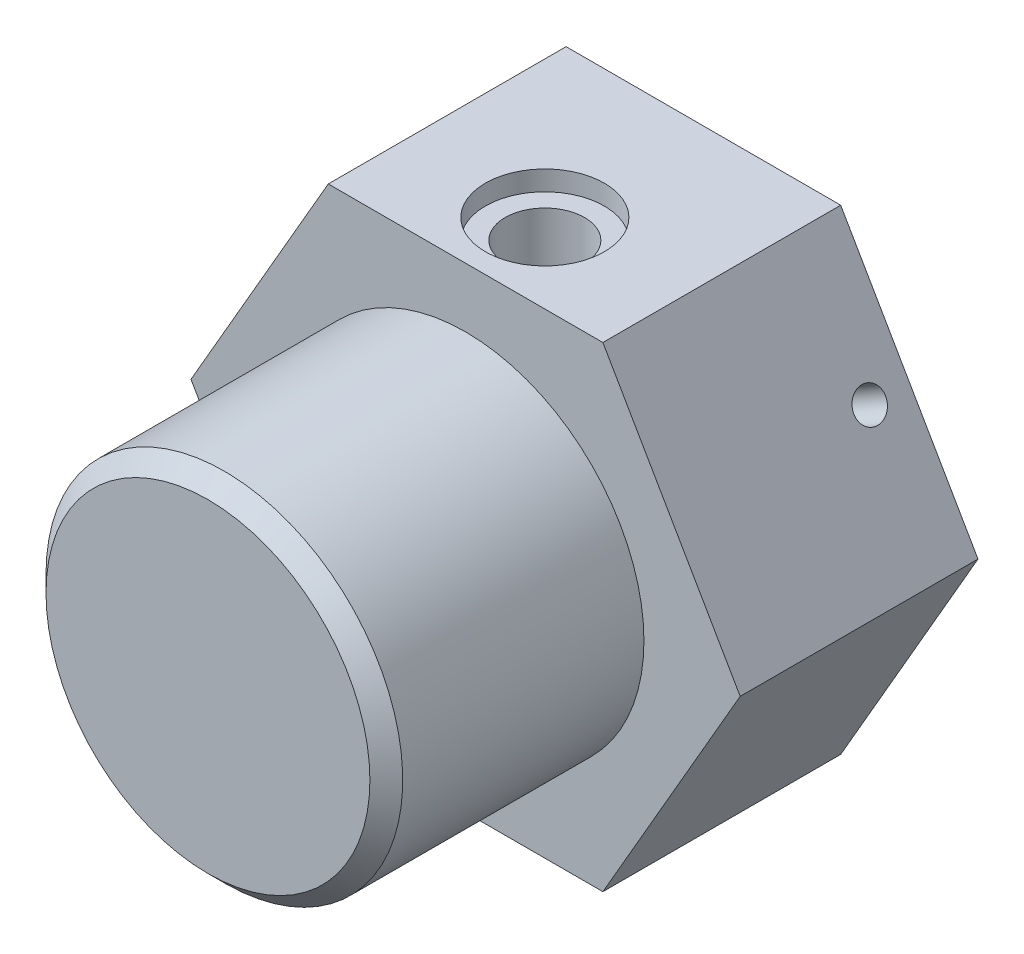
ISO-10303-21;
HEADER;
FILE_DESCRIPTION(('STEP AP214'),'2;1');
FILE_NAME('part.step','',(''),(''),'','','');
FILE_SCHEMA(('AUTOMOTIVE_DESIGN { 1 0 10303 214 1 1 1 1 }'));
ENDSEC;
DATA;
#1=APPLICATION_CONTEXT('core data for automotive mechanical design processes');
#2=APPLICATION_PROTOCOL_DEFINITION('international standard','automotive_design',2000,#1);
#3=PRODUCT_CONTEXT('',#1,'mechanical');
#4=PRODUCT('Part','Part','',(#3));
#5=PRODUCT_RELATED_PRODUCT_CATEGORY('part','',(#4));
#6=PRODUCT_DEFINITION_FORMATION('','',#4);
#7=PRODUCT_DEFINITION_CONTEXT('part definition',#1,'design');
#8=PRODUCT_DEFINITION('design','',#6,#7);
#9=PRODUCT_DEFINITION_SHAPE('','',#8);
#10=(LENGTH_UNIT() NAMED_UNIT(*) SI_UNIT(.MILLI.,.METRE.));
#11=(NAMED_UNIT(*) PLANE_ANGLE_UNIT() SI_UNIT($,.RADIAN.));
#12=(NAMED_UNIT(*) SI_UNIT($,.STERADIAN.) SOLID_ANGLE_UNIT());
#13=UNCERTAINTY_MEASURE_WITH_UNIT(LENGTH_MEASURE(1.E-05),#10,'distance_accuracy_value','');
#14=(GEOMETRIC_REPRESENTATION_CONTEXT(3) GLOBAL_UNCERTAINTY_ASSIGNED_CONTEXT((#13)) GLOBAL_UNIT_ASSIGNED_CONTEXT((#10,
#11,#12)) REPRESENTATION_CONTEXT('',''));
#15=CARTESIAN_POINT('',(0.,0.,0.));
#16=DIRECTION('',(0.,0.,1.));
#17=DIRECTION('',(1.,0.,0.));
#18=AXIS2_PLACEMENT_3D('',#15,#16,#17);
#19=CARTESIAN_POINT('',(0.,12.,8.));
#20=DIRECTION('',(0.,1.,0.));
#21=DIRECTION('',(0.,0.,1.));
#22=AXIS2_PLACEMENT_3D('',#19,#20,#21);
#23=CYLINDRICAL_SURFACE('',#22,1.99999999999999);
#24=CARTESIAN_POINT('',(0.,5.99999999999999,9.99999999999999));
#25=CARTESIAN_POINT('',(0.109126725773447,6.00000030601887,10.0000005074633));
#26=CARTESIAN_POINT('',(0.2182503890771,5.99699539015089,9.99103946774556));
#27=CARTESIAN_POINT('',(0.433283521745944,5.98530420406561,9.95554178236555));
#28=CARTESIAN_POINT('',(0.539192656237634,5.97661734404304,9.92900331210215));
#29=CARTESIAN_POINT('',(0.74466557900355,5.95450615812885,9.85936151323189));
#30=CARTESIAN_POINT('',(0.844239651772065,5.94108975461706,9.81628587508145));
#31=CARTESIAN_POINT('',(1.03474987361065,5.91088891434683,9.7149176543233));
#32=CARTESIAN_POINT('',(1.12568431391741,5.89410381335555,9.65662206999479));
#33=CARTESIAN_POINT('',(1.29948335004453,5.85828188886009,9.52434839028249));
#34=CARTESIAN_POINT('',(1.38200740059661,5.83919112927569,9.44993753147901));
#35=CARTESIAN_POINT('',(1.53366538540416,5.80120629566242,9.28846569058686));
#36=CARTESIAN_POINT('',(1.60279637097892,5.78231226581098,9.20140193014297));
#37=CARTESIAN_POINT('',(1.72764988445571,5.74626664954547,9.01402976960708));
#38=CARTESIAN_POINT('',(1.78292971644206,5.72918078551376,8.91341252053575));
#39=CARTESIAN_POINT('',(1.87563774775544,5.69950610837202,8.7036478110829));
#40=CARTESIAN_POINT('',(1.91307139477352,5.68691592321491,8.59450296567451));
#41=CARTESIAN_POINT('',(1.96774692301832,5.66822606538754,8.37465355700658));
#42=CARTESIAN_POINT('',(1.98562689654353,5.66192191539222,8.26412558302187));
#43=CARTESIAN_POINT('',(2.00268224666895,5.65591313259014,8.04147249168824));
#44=CARTESIAN_POINT('',(2.00186340320943,5.65620646045459,7.92934787858162));
#45=CARTESIAN_POINT('',(1.98203980740683,5.6631803001636,7.71212673911196));
#46=CARTESIAN_POINT('',(1.96386782633398,5.66956831735065,7.60694319416196));
#47=CARTESIAN_POINT('',(1.91121232569883,5.68753315449101,7.40121316078633));
#48=CARTESIAN_POINT('',(1.87672685318374,5.69911059568215,7.30066722912986));
#49=CARTESIAN_POINT('',(1.79187811612042,5.72635822262497,7.10517450081705));
#50=CARTESIAN_POINT('',(1.74126809741452,5.74209131586234,7.01034394906095));
#51=CARTESIAN_POINT('',(1.62577821260627,5.77585117151452,6.83025818344055));
#52=CARTESIAN_POINT('',(1.560894224728,5.79387859580926,6.74500574613324));
#53=CARTESIAN_POINT('',(1.41469866536447,5.83134658335481,6.58181680367846));
#54=CARTESIAN_POINT('',(1.33270630015262,5.85081178709685,6.50449461098187));
#55=CARTESIAN_POINT('',(1.15667913994012,5.88813876774073,6.36453746667321));
#56=CARTESIAN_POINT('',(1.06264319132163,5.90600039076134,6.30190392367102));
#57=CARTESIAN_POINT('',(0.863895226092532,5.93834215875586,6.19260739952987));
#58=CARTESIAN_POINT('',(0.759086552832671,5.95278700016078,6.14610901731854));
#59=CARTESIAN_POINT('',(0.542538166729014,5.97641134288869,6.07159365208859));
#60=CARTESIAN_POINT('',(0.430800876309906,5.98559267309758,6.04357024915313));
#61=CARTESIAN_POINT('',(0.208767659058608,5.9973525414288,6.00788866795529));
#62=CARTESIAN_POINT('',(0.0986191997296925,6.00020003667455,5.99940038165451));
#63=CARTESIAN_POINT('',(-0.121550139920474,5.99977805389654,6.00066534719695));
#64=CARTESIAN_POINT('',(-0.2315710386393,5.99650960838724,6.01041551995976));
#65=CARTESIAN_POINT('',(-0.445039732608509,5.98440049434208,6.04722381547193));
#66=CARTESIAN_POINT('',(-0.548585613669684,5.97572397422384,6.073772412099));
#67=CARTESIAN_POINT('',(-0.749711917159143,5.95383693660139,6.14278688893346));
#68=CARTESIAN_POINT('',(-0.847291577017209,5.94062584093349,6.18525479893558));
#69=CARTESIAN_POINT('',(-1.03657659278654,5.91057862574579,6.28614086368158));
#70=CARTESIAN_POINT('',(-1.12805991843429,5.89365629511571,6.34494918656635));
#71=CARTESIAN_POINT('',(-1.30012966027117,5.85810507832524,6.47638830002697));
#72=CARTESIAN_POINT('',(-1.38071273559115,5.83947567187654,6.54902331206354));
#73=CARTESIAN_POINT('',(-1.53250501561259,5.80153695960889,6.70995750201318));
#74=CARTESIAN_POINT('',(-1.60312193849153,5.78223522174855,6.79881845385373));
#75=CARTESIAN_POINT('',(-1.72851504464714,5.74599946589417,6.98754313562178));
#76=CARTESIAN_POINT('',(-1.78329109586202,5.72906546764004,7.08740695726816));
#77=CARTESIAN_POINT('',(-1.87519386083271,5.69964783582766,7.2953460305798));
#78=CARTESIAN_POINT('',(-1.91235626433003,5.68715521585957,7.40340415833754));
#79=CARTESIAN_POINT('',(-1.9677893335187,5.66821664612899,7.62475730008827));
#80=CARTESIAN_POINT('',(-1.98606850990787,5.66176797247278,7.7380499308087));
#81=CARTESIAN_POINT('',(-2.00255256495468,5.65595717748354,7.96039419208183));
#82=CARTESIAN_POINT('',(-2.00174051461679,5.6562480051483,8.06936468057365));
#83=CARTESIAN_POINT('',(-1.98248458689738,5.66302539647734,8.28553014984412));
#84=CARTESIAN_POINT('',(-1.96404175891716,5.66951159138723,8.39272523591018));
#85=CARTESIAN_POINT('',(-1.91074362625868,5.68769048609783,8.60027132600494));
#86=CARTESIAN_POINT('',(-1.87620669203102,5.69928196044954,8.70071365000899));
#87=CARTESIAN_POINT('',(-1.79195873151948,5.72632797636937,8.89445481387654));
#88=CARTESIAN_POINT('',(-1.7422443371076,5.74178337526786,8.98775206237601));
#89=CARTESIAN_POINT('',(-1.62652138516685,5.77565658452092,9.16896733984582));
#90=CARTESIAN_POINT('',(-1.55989648552915,5.79417423284273,9.25647300379677));
#91=CARTESIAN_POINT('',(-1.41328576627129,5.83166712566505,9.4193796267684));
#92=CARTESIAN_POINT('',(-1.33329616890296,5.85064249824744,9.49477715137614));
#93=CARTESIAN_POINT('',(-1.15848311384137,5.88780061051088,9.63428882457835));
#94=CARTESIAN_POINT('',(-1.06320302699945,5.90592363602513,9.69784869550199));
#95=CARTESIAN_POINT('',(-0.862714714813243,5.93851982345223,9.80798085770129));
#96=CARTESIAN_POINT('',(-0.757509036264691,5.95299391815859,9.85455749184408));
#97=CARTESIAN_POINT('',(-0.544987294401947,5.97611030137083,9.92744326497734));
#98=CARTESIAN_POINT('',(-0.437975515352813,5.98498424845044,9.95456493252674));
#99=CARTESIAN_POINT('',(-0.220640832020491,5.99692814128443,9.99084056135424));
#100=CARTESIAN_POINT('',(-0.110318851137491,5.99999969063809,9.99999948699307));
#101=CARTESIAN_POINT('',(0.,5.99999999999999,9.99999999999999));
#102=B_SPLINE_CURVE_WITH_KNOTS('',3,(#24,#25,#26,#27,#28,#29,#30,#31,#32,#33,#34,#35,#36,#37,
#38,#39,#40,#41,#42,#43,#44,#45,#46,#47,#48,#49,#50,#51,#52,#53,#54,#55,#56,#57,#58,#59,#60,#61,
#62,#63,#64,#65,#66,#67,#68,#69,#70,#71,#72,#73,#74,#75,#76,#77,#78,#79,#80,#81,#82,#83,#84,#85,
#86,#87,#88,#89,#90,#91,#92,#93,#94,#95,#96,#97,#98,#99,#100,#101),.UNSPECIFIED.,.T.,.F.,(4,2,2,
2,2,2,2,2,2,2,2,2,2,2,2,2,2,2,2,2,2,2,2,2,2,2,2,2,2,2,2,2,2,2,2,2,2,2,4),(0.,0.32697421205202,
0.653982370535039,0.980445345740543,1.30697275559819,1.64369368565511,1.9804886657506,
2.3269676964694,2.67334089385665,3.00803851483679,3.34263267974969,3.66193653102559,
3.98127861710962,4.3057634231026,4.63034205116413,4.97186611622732,5.31342291933235,
5.65836811300713,6.00319337754414,6.33307166350337,6.6628942632835,6.98316315956424,
7.30347290568205,7.6322079968747,7.96104361643779,8.304820457615,8.6486001646999,
8.99168027653537,9.33460569411677,9.65991332128513,9.98520158702746,10.3043117416083,
10.6234927635195,10.9566013338361,11.2898042224755,11.635993216702,11.9820936230491,
12.3127311674762,12.6432773207627),.UNSPECIFIED.);
#103=CARTESIAN_POINT('',(0.,5.99999999999999,9.99999999999999));
#104=VERTEX_POINT('',#103);
#105=EDGE_CURVE('E181',#104,#104,#102,.T.);
#106=ORIENTED_EDGE('',*,*,#105,.F.);
#107=EDGE_LOOP('',(#106));
#108=FACE_BOUND('',#107,.T.);
#109=CARTESIAN_POINT('',(0.,11.,8.));
#110=DIRECTION('',(0.,1.,0.));
#111=DIRECTION('',(-1.,0.,0.));
#112=AXIS2_PLACEMENT_3D('',#109,#110,#111);
#113=CIRCLE('',#112,1.99999999999999);
#114=CARTESIAN_POINT('',(-1.99999999999999,11.,8.));
#115=VERTEX_POINT('',#114);
#116=EDGE_CURVE('E62',#115,#115,#113,.F.);
#117=ORIENTED_EDGE('',*,*,#116,.F.);
#118=EDGE_LOOP('',(#117));
#119=FACE_BOUND('',#118,.T.);
#120=ADVANCED_FACE('F58',(#108,#119),#23,.F.);
#121=CARTESIAN_POINT('',(0.,-5.99999999999999,9.99999999999999));
#122=CARTESIAN_POINT('',(-0.109126725773445,-6.00000030601887,10.0000005074633));
#123=CARTESIAN_POINT('',(-0.218250389077098,-5.99699539015089,9.99103946774556));
#124=CARTESIAN_POINT('',(-0.433283521745942,-5.98530420406561,9.95554178236555));
#125=CARTESIAN_POINT('',(-0.539192656237632,-5.97661734404304,9.92900331210215));
#126=CARTESIAN_POINT('',(-0.744665579003548,-5.95450615812885,9.85936151323189));
#127=CARTESIAN_POINT('',(-0.844239651772063,-5.94108975461706,9.81628587508145));
#128=CARTESIAN_POINT('',(-1.03474987361064,-5.91088891434683,9.7149176543233));
#129=CARTESIAN_POINT('',(-1.12568431391741,-5.89410381335555,9.65662206999479));
#130=CARTESIAN_POINT('',(-1.29948335004453,-5.85828188886009,9.52434839028249));
#131=CARTESIAN_POINT('',(-1.38200740059661,-5.83919112927569,9.44993753147901));
#132=CARTESIAN_POINT('',(-1.53366538540416,-5.80120629566242,9.28846569058686));
#133=CARTESIAN_POINT('',(-1.60279637097892,-5.78231226581098,9.20140193014297));
#134=CARTESIAN_POINT('',(-1.72764988445571,-5.74626664954547,9.01402976960708));
#135=CARTESIAN_POINT('',(-1.78292971644206,-5.72918078551376,8.91341252053575));
#136=CARTESIAN_POINT('',(-1.87563774775543,-5.69950610837202,8.7036478110829));
#137=CARTESIAN_POINT('',(-1.91307139477352,-5.68691592321491,8.59450296567451));
#138=CARTESIAN_POINT('',(-1.96774692301832,-5.66822606538754,8.37465355700658));
#139=CARTESIAN_POINT('',(-1.98562689654353,-5.66192191539222,8.26412558302187));
#140=CARTESIAN_POINT('',(-2.00268224666894,-5.65591313259015,8.04147249168824));
#141=CARTESIAN_POINT('',(-2.00186340320943,-5.65620646045459,7.92934787858162));
#142=CARTESIAN_POINT('',(-1.98203980740683,-5.6631803001636,7.71212673911196));
#143=CARTESIAN_POINT('',(-1.96386782633398,-5.66956831735065,7.60694319416196));
#144=CARTESIAN_POINT('',(-1.91121232569882,-5.68753315449101,7.40121316078633));
#145=CARTESIAN_POINT('',(-1.87672685318373,-5.69911059568215,7.30066722912986));
#146=CARTESIAN_POINT('',(-1.79187811612041,-5.72635822262497,7.10517450081705));
#147=CARTESIAN_POINT('',(-1.74126809741452,-5.74209131586234,7.01034394906095));
#148=CARTESIAN_POINT('',(-1.62577821260627,-5.77585117151452,6.83025818344055));
#149=CARTESIAN_POINT('',(-1.560894224728,-5.79387859580927,6.74500574613324));
#150=CARTESIAN_POINT('',(-1.41469866536447,-5.83134658335481,6.58181680367846));
#151=CARTESIAN_POINT('',(-1.33270630015262,-5.85081178709685,6.50449461098187));
#152=CARTESIAN_POINT('',(-1.15667913994012,-5.88813876774073,6.36453746667321));
#153=CARTESIAN_POINT('',(-1.06264319132162,-5.90600039076134,6.30190392367101));
#154=CARTESIAN_POINT('',(-0.86389522609253,-5.93834215875586,6.19260739952987));
#155=CARTESIAN_POINT('',(-0.759086552832668,-5.95278700016078,6.14610901731854));
#156=CARTESIAN_POINT('',(-0.542538166729011,-5.97641134288869,6.07159365208859));
#157=CARTESIAN_POINT('',(-0.430800876309903,-5.98559267309758,6.04357024915313));
#158=CARTESIAN_POINT('',(-0.208767659058605,-5.9973525414288,6.00788866795529));
#159=CARTESIAN_POINT('',(-0.0986191997296898,-6.00020003667455,5.99940038165451));
#160=CARTESIAN_POINT('',(0.121550139920476,-5.99977805389654,6.00066534719695));
#161=CARTESIAN_POINT('',(0.231571038639302,-5.99650960838724,6.01041551995976));
#162=CARTESIAN_POINT('',(0.445039732608511,-5.98440049434208,6.04722381547193));
#163=CARTESIAN_POINT('',(0.548585613669687,-5.97572397422384,6.073772412099));
#164=CARTESIAN_POINT('',(0.749711917159146,-5.95383693660139,6.14278688893347));
#165=CARTESIAN_POINT('',(0.847291577017212,-5.94062584093349,6.18525479893558));
#166=CARTESIAN_POINT('',(1.03657659278654,-5.91057862574579,6.28614086368158));
#167=CARTESIAN_POINT('',(1.12805991843429,-5.89365629511571,6.34494918656635));
#168=CARTESIAN_POINT('',(1.30012966027117,-5.85810507832524,6.47638830002697));
#169=CARTESIAN_POINT('',(1.38071273559115,-5.83947567187654,6.54902331206354));
#170=CARTESIAN_POINT('',(1.53250501561259,-5.80153695960889,6.70995750201318));
#171=CARTESIAN_POINT('',(1.60312193849154,-5.78223522174855,6.79881845385373));
#172=CARTESIAN_POINT('',(1.72851504464714,-5.74599946589417,6.98754313562178));
#173=CARTESIAN_POINT('',(1.78329109586202,-5.72906546764004,7.08740695726816));
#174=CARTESIAN_POINT('',(1.87519386083272,-5.69964783582766,7.2953460305798));
#175=CARTESIAN_POINT('',(1.91235626433004,-5.68715521585957,7.40340415833754));
#176=CARTESIAN_POINT('',(1.96778933351871,-5.66821664612898,7.62475730008827));
#177=CARTESIAN_POINT('',(1.98606850990787,-5.66176797247278,7.7380499308087));
#178=CARTESIAN_POINT('',(2.00255256495468,-5.65595717748354,7.96039419208183));
#179=CARTESIAN_POINT('',(2.00174051461679,-5.6562480051483,8.06936468057365));
#180=CARTESIAN_POINT('',(1.98248458689738,-5.66302539647734,8.28553014984412));
#181=CARTESIAN_POINT('',(1.96404175891716,-5.66951159138723,8.39272523591018));
#182=CARTESIAN_POINT('',(1.91074362625868,-5.68769048609783,8.60027132600495));
#183=CARTESIAN_POINT('',(1.87620669203102,-5.69928196044954,8.70071365000899));
#184=CARTESIAN_POINT('',(1.79195873151949,-5.72632797636936,8.89445481387654));
#185=CARTESIAN_POINT('',(1.7422443371076,-5.74178337526786,8.98775206237601));
#186=CARTESIAN_POINT('',(1.62652138516685,-5.77565658452092,9.16896733984582));
#187=CARTESIAN_POINT('',(1.55989648552916,-5.79417423284273,9.25647300379677));
#188=CARTESIAN_POINT('',(1.41328576627129,-5.83166712566505,9.41937962676839));
#189=CARTESIAN_POINT('',(1.33329616890296,-5.85064249824744,9.49477715137614));
#190=CARTESIAN_POINT('',(1.15848311384137,-5.88780061051088,9.63428882457835));
#191=CARTESIAN_POINT('',(1.06320302699945,-5.90592363602513,9.69784869550199));
#192=CARTESIAN_POINT('',(0.862714714813245,-5.93851982345223,9.80798085770129));
#193=CARTESIAN_POINT('',(0.757509036264693,-5.95299391815859,9.85455749184408));
#194=CARTESIAN_POINT('',(0.544987294401949,-5.97611030137083,9.92744326497734));
#195=CARTESIAN_POINT('',(0.437975515352816,-5.98498424845044,9.95456493252674));
#196=CARTESIAN_POINT('',(0.220640832020494,-5.99692814128443,9.99084056135424));
#197=CARTESIAN_POINT('',(0.110318851137493,-5.99999969063809,9.99999948699307));
#198=CARTESIAN_POINT('',(0.,-5.99999999999999,9.99999999999999));
#199=B_SPLINE_CURVE_WITH_KNOTS('',3,(#121,#122,#123,#124,#125,#126,#127,#128,#129,#130,#131,
#132,#133,#134,#135,#136,#137,#138,#139,#140,#141,#142,#143,#144,#145,#146,#147,#148,#149,#150,
#151,#152,#153,#154,#155,#156,#157,#158,#159,#160,#161,#162,#163,#164,#165,#166,#167,#168,#169,
#170,#171,#172,#173,#174,#175,#176,#177,#178,#179,#180,#181,#182,#183,#184,#185,#186,#187,#188,
#189,#190,#191,#192,#193,#194,#195,#196,#197,#198),.UNSPECIFIED.,.T.,.F.,(4,2,2,2,2,2,2,2,2,2,2,
2,2,2,2,2,2,2,2,2,2,2,2,2,2,2,2,2,2,2,2,2,2,2,2,2,2,2,4),(0.,0.32697421205202,0.653982370535039,
0.980445345740543,1.3069727555982,1.64369368565511,1.9804886657506,2.3269676964694,
2.67334089385665,3.00803851483679,3.3426326797497,3.66193653102559,3.98127861710962,
4.3057634231026,4.63034205116413,4.97186611622732,5.31342291933235,5.65836811300713,
6.00319337754414,6.33307166350337,6.66289426328351,6.98316315956424,7.30347290568205,
7.6322079968747,7.96104361643779,8.30482045761501,8.6486001646999,8.99168027653537,
9.33460569411677,9.65991332128513,9.98520158702747,10.3043117416083,10.6234927635195,
10.956601333836,11.2898042224755,11.635993216702,11.9820936230491,12.3127311674762,
12.6432773207627),.UNSPECIFIED.);
#200=CARTESIAN_POINT('',(0.,-5.99999999999999,9.99999999999999));
#201=VERTEX_POINT('',#200);
#202=EDGE_CURVE('E190',#201,#201,#199,.T.);
#203=ORIENTED_EDGE('',*,*,#202,.F.);
#204=EDGE_LOOP('',(#203));
#205=FACE_BOUND('',#204,.T.);
#206=CARTESIAN_POINT('',(0.,-11.,8.));
#207=DIRECTION('',(0.,-1.,0.));
#208=DIRECTION('',(1.,0.,0.));
#209=AXIS2_PLACEMENT_3D('',#206,#207,#208);
#210=CIRCLE('',#209,1.99999999999999);
#211=CARTESIAN_POINT('',(1.99999999999999,-11.,8.));
#212=VERTEX_POINT('',#211);
#213=EDGE_CURVE('E251',#212,#212,#210,.F.);
#214=ORIENTED_EDGE('',*,*,#213,.F.);
#215=EDGE_LOOP('',(#214));
#216=FACE_BOUND('',#215,.T.);
#217=ADVANCED_FACE('F198',(#205,#216),#23,.F.);
#218=CARTESIAN_POINT('',(13.856406460551,0.,12.));
#219=DIRECTION('',(-0.866025403784439,-0.5,0.));
#220=DIRECTION('',(0.5,-0.866025403784439,0.));
#221=AXIS2_PLACEMENT_3D('',#218,#219,#220);
#222=PLANE('',#221);
#223=CARTESIAN_POINT('',(10.3923048454133,6.,2.));
#224=DIRECTION('',(0.866025403784439,0.5,0.));
#225=DIRECTION('',(-0.5,0.866025403784439,0.));
#226=AXIS2_PLACEMENT_3D('',#223,#224,#225);
#227=CIRCLE('',#226,0.799999999999988);
#228=CARTESIAN_POINT('',(9.99230484541328,6.69282032302754,2.));
#229=VERTEX_POINT('',#228);
#230=EDGE_CURVE('E217',#229,#229,#227,.T.);
#231=ORIENTED_EDGE('',*,*,#230,.F.);
#232=EDGE_LOOP('',(#231));
#233=FACE_BOUND('',#232,.T.);
#234=DIRECTION('',(-0.5,0.866025403784439,0.));
#235=VECTOR('',#234,1.);
#236=CARTESIAN_POINT('',(13.856406460551,0.,0.));
#237=LINE('',#236,#235);
#238=CARTESIAN_POINT('',(13.856406460551,0.,0.));
#239=VERTEX_POINT('',#238);
#240=CARTESIAN_POINT('',(6.92820323027551,12.,0.));
#241=VERTEX_POINT('',#240);
#242=EDGE_CURVE('E154',#239,#241,#237,.T.);
#243=ORIENTED_EDGE('',*,*,#242,.T.);
#244=DIRECTION('',(0.,0.,-1.));
#245=VECTOR('',#244,1.);
#246=CARTESIAN_POINT('',(6.92820323027551,12.,12.));
#247=LINE('',#246,#245);
#248=CARTESIAN_POINT('',(6.92820323027551,12.,12.));
#249=VERTEX_POINT('',#248);
#250=EDGE_CURVE('E13',#249,#241,#247,.T.);
#251=ORIENTED_EDGE('',*,*,#250,.F.);
#252=DIRECTION('',(-0.5,0.866025403784439,0.));
#253=VECTOR('',#252,1.);
#254=CARTESIAN_POINT('',(13.856406460551,0.,12.));
#255=LINE('',#254,#253);
#256=CARTESIAN_POINT('',(13.856406460551,0.,12.));
#257=VERTEX_POINT('',#256);
#258=EDGE_CURVE('E171',#257,#249,#255,.T.);
#259=ORIENTED_EDGE('',*,*,#258,.F.);
#260=DIRECTION('',(0.,0.,-1.));
#261=VECTOR('',#260,1.);
#262=CARTESIAN_POINT('',(13.856406460551,0.,12.));
#263=LINE('',#262,#261);
#264=EDGE_CURVE('E150',#257,#239,#263,.T.);
#265=ORIENTED_EDGE('',*,*,#264,.T.);
#266=EDGE_LOOP('',(#243,#251,#259,#265));
#267=FACE_BOUND('',#266,.T.);
#268=ADVANCED_FACE('F60',(#233,#267),#222,.F.);
#269=CARTESIAN_POINT('',(6.92820323027551,12.,12.));
#270=DIRECTION('',(0.,-1.,0.));
#271=DIRECTION('',(1.,0.,0.));
#272=AXIS2_PLACEMENT_3D('',#269,#270,#271);
#273=PLANE('',#272);
#274=CARTESIAN_POINT('',(0.,12.,8.));
#275=DIRECTION('',(0.,1.,0.));
#276=DIRECTION('',(-1.,0.,0.));
#277=AXIS2_PLACEMENT_3D('',#274,#275,#276);
#278=CIRCLE('',#277,3.);
#279=CARTESIAN_POINT('',(-3.,12.,8.));
#280=VERTEX_POINT('',#279);
#281=EDGE_CURVE('E271',#280,#280,#278,.T.);
#282=ORIENTED_EDGE('',*,*,#281,.F.);
#283=EDGE_LOOP('',(#282));
#284=FACE_BOUND('',#283,.T.);
#285=DIRECTION('',(-1.,0.,0.));
#286=VECTOR('',#285,1.);
#287=CARTESIAN_POINT('',(6.92820323027551,12.,0.));
#288=LINE('',#287,#286);
#289=CARTESIAN_POINT('',(-6.92820323027551,12.,0.));
#290=VERTEX_POINT('',#289);
#291=EDGE_CURVE('E158',#241,#290,#288,.T.);
#292=ORIENTED_EDGE('',*,*,#291,.T.);
#293=DIRECTION('',(0.,0.,-1.));
#294=VECTOR('',#293,1.);
#295=CARTESIAN_POINT('',(-6.92820323027551,12.,12.));
#296=LINE('',#295,#294);
#297=CARTESIAN_POINT('',(-6.92820323027551,12.,12.));
#298=VERTEX_POINT('',#297);
#299=EDGE_CURVE('E69',#298,#290,#296,.T.);
#300=ORIENTED_EDGE('',*,*,#299,.F.);
#301=DIRECTION('',(-1.,0.,0.));
#302=VECTOR('',#301,1.);
#303=CARTESIAN_POINT('',(6.92820323027551,12.,12.));
#304=LINE('',#303,#302);
#305=EDGE_CURVE('E116',#249,#298,#304,.T.);
#306=ORIENTED_EDGE('',*,*,#305,.F.);
#307=ORIENTED_EDGE('',*,*,#250,.T.);
#308=EDGE_LOOP('',(#292,#300,#306,#307));
#309=FACE_BOUND('',#308,.T.);
#310=ADVANCED_FACE('F355',(#284,#309),#273,.F.);
#311=CARTESIAN_POINT('',(-6.92820323027551,12.,12.));
#312=DIRECTION('',(0.866025403784439,-0.499999999999999,0.));
#313=DIRECTION('',(0.499999999999999,0.866025403784439,0.));
#314=AXIS2_PLACEMENT_3D('',#311,#312,#313);
#315=PLANE('',#314);
#316=DIRECTION('',(-0.499999999999999,-0.866025403784439,0.));
#317=VECTOR('',#316,1.);
#318=CARTESIAN_POINT('',(-6.92820323027551,12.,0.));
#319=LINE('',#318,#317);
#320=CARTESIAN_POINT('',(-13.856406460551,0.,0.));
#321=VERTEX_POINT('',#320);
#322=EDGE_CURVE('E162',#290,#321,#319,.T.);
#323=ORIENTED_EDGE('',*,*,#322,.T.);
#324=DIRECTION('',(0.,0.,-1.));
#325=VECTOR('',#324,1.);
#326=CARTESIAN_POINT('',(-13.856406460551,0.,12.));
#327=LINE('',#326,#325);
#328=CARTESIAN_POINT('',(-13.856406460551,0.,12.));
#329=VERTEX_POINT('',#328);
#330=EDGE_CURVE('E142',#329,#321,#327,.T.);
#331=ORIENTED_EDGE('',*,*,#330,.F.);
#332=DIRECTION('',(-0.499999999999999,-0.866025403784439,0.));
#333=VECTOR('',#332,1.);
#334=CARTESIAN_POINT('',(-6.92820323027551,12.,12.));
#335=LINE('',#334,#333);
#336=EDGE_CURVE('E131',#298,#329,#335,.T.);
#337=ORIENTED_EDGE('',*,*,#336,.F.);
#338=ORIENTED_EDGE('',*,*,#299,.T.);
#339=EDGE_LOOP('',(#323,#331,#337,#338));
#340=FACE_BOUND('',#339,.T.);
#341=ADVANCED_FACE('F351',(#340),#315,.F.);
#342=CARTESIAN_POINT('',(-13.856406460551,0.,12.));
#343=DIRECTION('',(0.866025403784439,0.5,0.));
#344=DIRECTION('',(-0.5,0.866025403784439,0.));
#345=AXIS2_PLACEMENT_3D('',#342,#343,#344);
#346=PLANE('',#345);
#347=DIRECTION('',(0.5,-0.866025403784438,0.));
#348=VECTOR('',#347,1.);
#349=CARTESIAN_POINT('',(-13.856406460551,0.,0.));
#350=LINE('',#349,#348);
#351=CARTESIAN_POINT('',(-6.9282032302755,-12.,0.));
#352=VERTEX_POINT('',#351);
#353=EDGE_CURVE('E140',#321,#352,#350,.T.);
#354=ORIENTED_EDGE('',*,*,#353,.T.);
#355=DIRECTION('',(0.,0.,-1.));
#356=VECTOR('',#355,1.);
#357=CARTESIAN_POINT('',(-6.9282032302755,-12.,12.));
#358=LINE('',#357,#356);
#359=CARTESIAN_POINT('',(-6.9282032302755,-12.,12.));
#360=VERTEX_POINT('',#359);
#361=EDGE_CURVE('E137',#360,#352,#358,.T.);
#362=ORIENTED_EDGE('',*,*,#361,.F.);
#363=DIRECTION('',(0.5,-0.866025403784438,0.));
#364=VECTOR('',#363,1.);
#365=CARTESIAN_POINT('',(-13.856406460551,0.,12.));
#366=LINE('',#365,#364);
#367=EDGE_CURVE('E124',#329,#360,#366,.T.);
#368=ORIENTED_EDGE('',*,*,#367,.F.);
#369=ORIENTED_EDGE('',*,*,#330,.T.);
#370=EDGE_LOOP('',(#354,#362,#368,#369));
#371=FACE_BOUND('',#370,.T.);
#372=ADVANCED_FACE('F138',(#371),#346,.F.);
#373=CARTESIAN_POINT('',(-6.9282032302755,-12.,12.));
#374=DIRECTION('',(0.,1.,0.));
#375=DIRECTION('',(-1.,0.,0.));
#376=AXIS2_PLACEMENT_3D('',#373,#374,#375);
#377=PLANE('',#376);
#378=CARTESIAN_POINT('',(0.,-12.,8.));
#379=DIRECTION('',(0.,-1.,0.));
#380=DIRECTION('',(1.,0.,0.));
#381=AXIS2_PLACEMENT_3D('',#378,#379,#380);
#382=CIRCLE('',#381,3.);
#383=CARTESIAN_POINT('',(3.,-12.,8.));
#384=VERTEX_POINT('',#383);
#385=EDGE_CURVE('E259',#384,#384,#382,.T.);
#386=ORIENTED_EDGE('',*,*,#385,.F.);
#387=EDGE_LOOP('',(#386));
#388=FACE_BOUND('',#387,.T.);
#389=DIRECTION('',(1.,0.,0.));
#390=VECTOR('',#389,1.);
#391=CARTESIAN_POINT('',(-6.9282032302755,-12.,0.));
#392=LINE('',#391,#390);
#393=CARTESIAN_POINT('',(6.92820323027551,-12.,0.));
#394=VERTEX_POINT('',#393);
#395=EDGE_CURVE('E102',#352,#394,#392,.T.);
#396=ORIENTED_EDGE('',*,*,#395,.T.);
#397=DIRECTION('',(0.,0.,-1.));
#398=VECTOR('',#397,1.);
#399=CARTESIAN_POINT('',(6.92820323027551,-12.,12.));
#400=LINE('',#399,#398);
#401=CARTESIAN_POINT('',(6.92820323027551,-12.,12.));
#402=VERTEX_POINT('',#401);
#403=EDGE_CURVE('E143',#402,#394,#400,.T.);
#404=ORIENTED_EDGE('',*,*,#403,.F.);
#405=DIRECTION('',(1.,0.,0.));
#406=VECTOR('',#405,1.);
#407=CARTESIAN_POINT('',(-6.9282032302755,-12.,12.));
#408=LINE('',#407,#406);
#409=EDGE_CURVE('E129',#360,#402,#408,.T.);
#410=ORIENTED_EDGE('',*,*,#409,.F.);
#411=ORIENTED_EDGE('',*,*,#361,.T.);
#412=EDGE_LOOP('',(#396,#404,#410,#411));
#413=FACE_BOUND('',#412,.T.);
#414=ADVANCED_FACE('F145',(#388,#413),#377,.F.);
#415=CARTESIAN_POINT('',(6.92820323027551,-12.,12.));
#416=DIRECTION('',(-0.866025403784439,0.5,0.));
#417=DIRECTION('',(-0.5,-0.866025403784439,0.));
#418=AXIS2_PLACEMENT_3D('',#415,#416,#417);
#419=PLANE('',#418);
#420=DIRECTION('',(0.5,0.866025403784439,0.));
#421=VECTOR('',#420,1.);
#422=CARTESIAN_POINT('',(6.92820323027551,-12.,0.));
#423=LINE('',#422,#421);
#424=EDGE_CURVE('E108',#394,#239,#423,.T.);
#425=ORIENTED_EDGE('',*,*,#424,.T.);
#426=ORIENTED_EDGE('',*,*,#264,.F.);
#427=DIRECTION('',(0.5,0.866025403784439,0.));
#428=VECTOR('',#427,1.);
#429=CARTESIAN_POINT('',(6.92820323027551,-12.,12.));
#430=LINE('',#429,#428);
#431=EDGE_CURVE('E78',#402,#257,#430,.T.);
#432=ORIENTED_EDGE('',*,*,#431,.F.);
#433=ORIENTED_EDGE('',*,*,#403,.T.);
#434=EDGE_LOOP('',(#425,#426,#432,#433));
#435=FACE_BOUND('',#434,.T.);
#436=ADVANCED_FACE('F296',(#435),#419,.F.);
#437=CARTESIAN_POINT('',(0.,0.,12.));
#438=DIRECTION('',(0.,0.,1.));
#439=DIRECTION('',(1.,0.,0.));
#440=AXIS2_PLACEMENT_3D('',#437,#438,#439);
#441=PLANE('',#440);
#442=ORIENTED_EDGE('',*,*,#258,.T.);
#443=ORIENTED_EDGE('',*,*,#305,.T.);
#444=ORIENTED_EDGE('',*,*,#336,.T.);
#445=ORIENTED_EDGE('',*,*,#367,.T.);
#446=ORIENTED_EDGE('',*,*,#409,.T.);
#447=ORIENTED_EDGE('',*,*,#431,.T.);
#448=EDGE_LOOP('',(#442,#443,#444,#445,#446,#447));
#449=FACE_BOUND('',#448,.T.);
#450=CARTESIAN_POINT('',(0.,0.,12.));
#451=DIRECTION('',(0.,0.,1.));
#452=DIRECTION('',(1.,0.,0.));
#453=AXIS2_PLACEMENT_3D('',#450,#451,#452);
#454=CIRCLE('',#453,9.);
#455=CARTESIAN_POINT('',(9.,0.,12.));
#456=VERTEX_POINT('',#455);
#457=EDGE_CURVE('E286',#456,#456,#454,.T.);
#458=ORIENTED_EDGE('',*,*,#457,.F.);
#459=EDGE_LOOP('',(#458));
#460=FACE_BOUND('',#459,.T.);
#461=ADVANCED_FACE('F126',(#449,#460),#441,.T.);
#462=CARTESIAN_POINT('',(0.,0.,0.));
#463=DIRECTION('',(0.,0.,1.));
#464=DIRECTION('',(1.,0.,0.));
#465=AXIS2_PLACEMENT_3D('',#462,#463,#464);
#466=PLANE('',#465);
#467=CARTESIAN_POINT('',(0.,0.,0.));
#468=DIRECTION('',(0.,0.,-1.));
#469=DIRECTION('',(-1.,0.,0.));
#470=AXIS2_PLACEMENT_3D('',#467,#468,#469);
#471=CIRCLE('',#470,5.99999999999999);
#472=CARTESIAN_POINT('',(-5.99999999999999,0.,0.));
#473=VERTEX_POINT('',#472);
#474=EDGE_CURVE('E219',#473,#473,#471,.T.);
#475=ORIENTED_EDGE('',*,*,#474,.F.);
#476=EDGE_LOOP('',(#475));
#477=FACE_BOUND('',#476,.T.);
#478=ORIENTED_EDGE('',*,*,#242,.F.);
#479=ORIENTED_EDGE('',*,*,#424,.F.);
#480=ORIENTED_EDGE('',*,*,#395,.F.);
#481=ORIENTED_EDGE('',*,*,#353,.F.);
#482=ORIENTED_EDGE('',*,*,#322,.F.);
#483=ORIENTED_EDGE('',*,*,#291,.F.);
#484=EDGE_LOOP('',(#478,#479,#480,#481,#482,#483));
#485=FACE_BOUND('',#484,.T.);
#486=ADVANCED_FACE('F295',(#477,#485),#466,.F.);
#487=CARTESIAN_POINT('',(0.,0.,15.));
#488=DIRECTION('',(0.,0.,-1.));
#489=DIRECTION('',(-1.,0.,0.));
#490=AXIS2_PLACEMENT_3D('',#487,#488,#489);
#491=CONICAL_SURFACE('',#490,6.,1.02974425867665);
#492=CARTESIAN_POINT('',(0.,0.,18.6051637141654));
#493=VERTEX_POINT('',#492);
#494=VERTEX_LOOP('',#493);
#495=FACE_BOUND('',#494,.T.);
#496=CARTESIAN_POINT('',(0.,0.,15.));
#497=DIRECTION('',(0.,0.,-1.));
#498=DIRECTION('',(-1.,0.,0.));
#499=AXIS2_PLACEMENT_3D('',#496,#497,#498);
#500=CIRCLE('',#499,6.);
#501=CARTESIAN_POINT('',(-6.,0.,15.));
#502=VERTEX_POINT('',#501);
#503=EDGE_CURVE('E159',#502,#502,#500,.T.);
#504=ORIENTED_EDGE('',*,*,#503,.T.);
#505=EDGE_LOOP('',(#504));
#506=FACE_BOUND('',#505,.T.);
#507=ADVANCED_FACE('F302',(#495,#506),#491,.F.);
#508=CARTESIAN_POINT('',(0.,0.,0.));
#509=DIRECTION('',(0.,0.,-1.));
#510=DIRECTION('',(-1.,0.,0.));
#511=AXIS2_PLACEMENT_3D('',#508,#509,#510);
#512=CYLINDRICAL_SURFACE('',#511,5.99999999999999);
#513=CARTESIAN_POINT('',(4.74975727583349,3.66603407249124,2.));
#514=CARTESIAN_POINT('',(4.74975880685315,3.6660327790987,2.0447215421841));
#515=CARTESIAN_POINT('',(4.75208026078017,3.66303046463284,2.08947041323713));
#516=CARTESIAN_POINT('',(4.76126703562153,3.65108077552885,2.17772098492557));
#517=CARTESIAN_POINT('',(4.76813700556613,3.64212731820138,2.22122136196513));
#518=CARTESIAN_POINT('',(4.78610518784686,3.61848258121518,2.30568454729362));
#519=CARTESIAN_POINT('',(4.79720041294779,3.60379535511955,2.3466491246479));
#520=CARTESIAN_POINT('',(4.82313269088926,3.56901378580909,2.42492443028299));
#521=CARTESIAN_POINT('',(4.8379691432678,3.5489203102555,2.46223574357499));
#522=CARTESIAN_POINT('',(4.87085975742792,3.5036424421416,2.53238938186761));
#523=CARTESIAN_POINT('',(4.88893170030613,3.47842980828112,2.56520514627181));
#524=CARTESIAN_POINT('',(4.92751219813228,3.42355752798976,2.62520649818249));
#525=CARTESIAN_POINT('',(4.94802087811043,3.39389765334829,2.65239179659046));
#526=CARTESIAN_POINT('',(4.9907741775501,3.33071035346217,2.70045673668657));
#527=CARTESIAN_POINT('',(5.01302505583248,3.29716875570023,2.7213121957161));
#528=CARTESIAN_POINT('',(5.05838363000065,3.22714937599096,2.75597046567231));
#529=CARTESIAN_POINT('',(5.08149128983923,3.19067171749659,2.76977357295106));
#530=CARTESIAN_POINT('',(5.12763408712788,3.11597232803722,2.7898555638321));
#531=CARTESIAN_POINT('',(5.15066883806939,3.07776226514263,2.79617872600478));
#532=CARTESIAN_POINT('',(5.19608038787162,3.00045955176629,2.80125864349472));
#533=CARTESIAN_POINT('',(5.21845721593006,2.96136694058734,2.8000157350946));
#534=CARTESIAN_POINT('',(5.2617830220211,2.88367922039138,2.79003410778362));
#535=CARTESIAN_POINT('',(5.28274016106631,2.84508252855101,2.78134301410174));
#536=CARTESIAN_POINT('',(5.32287322870752,2.76927091836868,2.75678626919139));
#537=CARTESIAN_POINT('',(5.34204911954897,2.73205602932484,2.74092046593275));
#538=CARTESIAN_POINT('',(5.37828468595309,2.66001621839293,2.70241462355127));
#539=CARTESIAN_POINT('',(5.39533775546902,2.62519890070003,2.67975415072676));
#540=CARTESIAN_POINT('',(5.42698028371283,2.55914602028713,2.62831709708685));
#541=CARTESIAN_POINT('',(5.44156961390525,2.52791064446745,2.59954019734887));
#542=CARTESIAN_POINT('',(5.46820233052235,2.46977644223403,2.53642086065642));
#543=CARTESIAN_POINT('',(5.48022504110781,2.44291321928522,2.50203689272254));
#544=CARTESIAN_POINT('',(5.50146326106599,2.39470210601402,2.42882162745097));
#545=CARTESIAN_POINT('',(5.51067875930712,2.37335423756202,2.38999031247881));
#546=CARTESIAN_POINT('',(5.52624055861062,2.33689118831329,2.30894399986132));
#547=CARTESIAN_POINT('',(5.53258535227461,2.3217792823673,2.2667272381926));
#548=CARTESIAN_POINT('',(5.54236349016341,2.29834064474793,2.18012879174465));
#549=CARTESIAN_POINT('',(5.54579699480128,2.29001353923067,2.13574722638937));
#550=CARTESIAN_POINT('',(5.54972265799877,2.2804835485127,2.04644346599802));
#551=CARTESIAN_POINT('',(5.55023717317216,2.27922651410137,2.00152802786699));
#552=CARTESIAN_POINT('',(5.54838275533305,2.28373696229774,1.91211229755811));
#553=CARTESIAN_POINT('',(5.54601389248932,2.28950427396364,1.86761199530422));
#554=CARTESIAN_POINT('',(5.53841761510554,2.3078186605969,1.78046560543776));
#555=CARTESIAN_POINT('',(5.53320130949816,2.32033938574373,1.73781300279276));
#556=CARTESIAN_POINT('',(5.51994313741854,2.35170490321518,1.65536843461903));
#557=CARTESIAN_POINT('',(5.5119011588333,2.37054994646568,1.61557658267052));
#558=CARTESIAN_POINT('',(5.49298554247735,2.41405752814407,1.53972107582368));
#559=CARTESIAN_POINT('',(5.48209523155566,2.43875423732759,1.50368118065271));
#560=CARTESIAN_POINT('',(5.45759872167128,2.49309087487446,1.43659562462517));
#561=CARTESIAN_POINT('',(5.44399240216791,2.52273102262569,1.4055501855408));
#562=CARTESIAN_POINT('',(5.41412191009694,2.58621736258289,1.34912937843156));
#563=CARTESIAN_POINT('',(5.39784099717941,2.62008970210473,1.32379227345136));
#564=CARTESIAN_POINT('',(5.36293274208485,2.69081874496076,1.27977268712988));
#565=CARTESIAN_POINT('',(5.34430545270185,2.72767538114093,1.26109005609756));
#566=CARTESIAN_POINT('',(5.30512247791464,2.80311884540536,1.23097229536476));
#567=CARTESIAN_POINT('',(5.28457279194376,2.84170010662354,1.21951542836659));
#568=CARTESIAN_POINT('',(5.241976772403,2.91952843159501,1.20410380581562));
#569=CARTESIAN_POINT('',(5.21993051616828,2.95877546086628,1.20014866291692));
#570=CARTESIAN_POINT('',(5.17511454650506,3.0364758484518,1.19986069310388));
#571=CARTESIAN_POINT('',(5.1523517667047,3.0749330009076,1.20346901176225));
#572=CARTESIAN_POINT('',(5.10662463409873,3.15029014431704,1.2180804164928));
#573=CARTESIAN_POINT('',(5.08366028157547,3.18719013745143,1.22908349220853));
#574=CARTESIAN_POINT('',(5.03829097762817,3.25843649657189,1.25815281883067));
#575=CARTESIAN_POINT('',(5.0158857761909,3.29278401794182,1.27621585056323));
#576=CARTESIAN_POINT('',(4.97240391671574,3.35808577566171,1.3188862198583));
#577=CARTESIAN_POINT('',(4.9513272832182,3.38903994933999,1.34349367826098));
#578=CARTESIAN_POINT('',(4.91112826185755,3.4470386576541,1.39877067280146));
#579=CARTESIAN_POINT('',(4.89202156725846,3.47405241618489,1.42948391605568));
#580=CARTESIAN_POINT('',(4.85668943786087,3.52327805621597,1.49600922761895));
#581=CARTESIAN_POINT('',(4.84046468411999,3.54548880294184,1.53182249756852));
#582=CARTESIAN_POINT('',(4.81150909774117,3.58468666071288,1.60771357662835));
#583=CARTESIAN_POINT('',(4.79879393427114,3.60165038487537,1.64780943660401));
#584=CARTESIAN_POINT('',(4.7775206698923,3.62982239820594,1.73097938700686));
#585=CARTESIAN_POINT('',(4.76895811268353,3.64103685784263,1.77405022790387));
#586=CARTESIAN_POINT('',(4.758388412157,3.65483057859661,1.84777931149014));
#587=CARTESIAN_POINT('',(4.75515868006762,3.65902699704848,1.877975309187));
#588=CARTESIAN_POINT('',(4.75084259757613,3.66462917403133,1.93877660378846));
#589=CARTESIAN_POINT('',(4.74975622763803,3.66603495799796,1.96938189695992));
#590=CARTESIAN_POINT('',(4.74975727583349,3.66603407249124,2.));
#591=B_SPLINE_CURVE_WITH_KNOTS('',3,(#513,#514,#515,#516,#517,#518,#519,#520,#521,#522,#523,
#524,#525,#526,#527,#528,#529,#530,#531,#532,#533,#534,#535,#536,#537,#538,#539,#540,#541,#542,
#543,#544,#545,#546,#547,#548,#549,#550,#551,#552,#553,#554,#555,#556,#557,#558,#559,#560,#561,
#562,#563,#564,#565,#566,#567,#568,#569,#570,#571,#572,#573,#574,#575,#576,#577,#578,#579,#580,
#581,#582,#583,#584,#585,#586,#587,#588,#589,#590),.UNSPECIFIED.,.T.,.F.,(4,2,2,2,2,2,2,2,2,2,2,
2,2,2,2,2,2,2,2,2,2,2,2,2,2,2,2,2,2,2,2,2,2,2,2,2,2,2,4),(0.,0.134052755695639,
0.268242738433454,0.402338025098478,0.536411803331004,0.671246380475839,0.806087879040129,
0.941438226091761,1.07678288501889,1.21132227809105,1.3458556914506,1.47953523467098,
1.61321761065788,1.74730611381617,1.88140161032968,2.016539660267,2.15167824606753,
2.28688771061413,2.42208972458757,2.55625481031888,2.69041663112533,2.82405873926554,
2.957706150464,3.09215411256049,3.22660804299364,3.36193804704917,3.49726500669176,
3.63218289507249,3.76709381687974,3.90095883941635,4.03482367447371,4.16862754139192,
4.30243387911546,4.43723496946692,4.57206787362875,4.70749336791954,4.8427732092441,
4.93455176376816,5.02632948175918),.UNSPECIFIED.);
#592=CARTESIAN_POINT('',(4.74975727583349,3.66603407249124,2.));
#593=VERTEX_POINT('',#592);
#594=EDGE_CURVE('E191',#593,#593,#591,.T.);
#595=ORIENTED_EDGE('',*,*,#594,.T.);
#596=EDGE_LOOP('',(#595));
#597=FACE_BOUND('',#596,.T.);
#598=ORIENTED_EDGE('',*,*,#202,.T.);
#599=EDGE_LOOP('',(#598));
#600=FACE_BOUND('',#599,.T.);
#601=ORIENTED_EDGE('',*,*,#105,.T.);
#602=EDGE_LOOP('',(#601));
#603=FACE_BOUND('',#602,.T.);
#604=ORIENTED_EDGE('',*,*,#503,.F.);
#605=EDGE_LOOP('',(#604));
#606=FACE_BOUND('',#605,.T.);
#607=ORIENTED_EDGE('',*,*,#474,.T.);
#608=EDGE_LOOP('',(#607));
#609=FACE_BOUND('',#608,.T.);
#610=ADVANCED_FACE('F195',(#597,#600,#603,#606,#609),#512,.F.);
#611=CARTESIAN_POINT('',(10.3923048454133,6.,2.));
#612=DIRECTION('',(0.866025403784439,0.5,0.));
#613=DIRECTION('',(-0.5,0.866025403784439,0.));
#614=AXIS2_PLACEMENT_3D('',#611,#612,#613);
#615=CYLINDRICAL_SURFACE('',#614,0.799999999999993);
#616=ORIENTED_EDGE('',*,*,#594,.F.);
#617=EDGE_LOOP('',(#616));
#618=FACE_BOUND('',#617,.T.);
#619=ORIENTED_EDGE('',*,*,#230,.T.);
#620=EDGE_LOOP('',(#619));
#621=FACE_BOUND('',#620,.T.);
#622=ADVANCED_FACE('F206',(#618,#621),#615,.F.);
#623=CARTESIAN_POINT('',(0.,-11.,8.));
#624=DIRECTION('',(0.,-1.,0.));
#625=DIRECTION('',(1.,0.,0.));
#626=AXIS2_PLACEMENT_3D('',#623,#624,#625);
#627=PLANE('',#626);
#628=CARTESIAN_POINT('',(0.,-11.,8.));
#629=DIRECTION('',(0.,-1.,0.));
#630=DIRECTION('',(1.,0.,0.));
#631=AXIS2_PLACEMENT_3D('',#628,#629,#630);
#632=CIRCLE('',#631,3.);
#633=CARTESIAN_POINT('',(3.,-11.,8.));
#634=VERTEX_POINT('',#633);
#635=EDGE_CURVE('E255',#634,#634,#632,.T.);
#636=ORIENTED_EDGE('',*,*,#635,.T.);
#637=EDGE_LOOP('',(#636));
#638=FACE_BOUND('',#637,.T.);
#639=ORIENTED_EDGE('',*,*,#213,.T.);
#640=EDGE_LOOP('',(#639));
#641=FACE_BOUND('',#640,.T.);
#642=ADVANCED_FACE('F328',(#638,#641),#627,.T.);
#643=CARTESIAN_POINT('',(0.,-11.,8.));
#644=DIRECTION('',(0.,-1.,0.));
#645=DIRECTION('',(1.,0.,0.));
#646=AXIS2_PLACEMENT_3D('',#643,#644,#645);
#647=CYLINDRICAL_SURFACE('',#646,3.);
#648=ORIENTED_EDGE('',*,*,#635,.F.);
#649=EDGE_LOOP('',(#648));
#650=FACE_BOUND('',#649,.T.);
#651=ORIENTED_EDGE('',*,*,#385,.T.);
#652=EDGE_LOOP('',(#651));
#653=FACE_BOUND('',#652,.T.);
#654=ADVANCED_FACE('F318',(#650,#653),#647,.F.);
#655=CARTESIAN_POINT('',(0.,11.,8.));
#656=DIRECTION('',(0.,1.,0.));
#657=DIRECTION('',(-1.,0.,0.));
#658=AXIS2_PLACEMENT_3D('',#655,#656,#657);
#659=PLANE('',#658);
#660=CARTESIAN_POINT('',(0.,11.,8.));
#661=DIRECTION('',(0.,1.,0.));
#662=DIRECTION('',(-1.,0.,0.));
#663=AXIS2_PLACEMENT_3D('',#660,#661,#662);
#664=CIRCLE('',#663,3.);
#665=CARTESIAN_POINT('',(-3.,11.,8.));
#666=VERTEX_POINT('',#665);
#667=EDGE_CURVE('E267',#666,#666,#664,.T.);
#668=ORIENTED_EDGE('',*,*,#667,.T.);
#669=EDGE_LOOP('',(#668));
#670=FACE_BOUND('',#669,.T.);
#671=ORIENTED_EDGE('',*,*,#116,.T.);
#672=EDGE_LOOP('',(#671));
#673=FACE_BOUND('',#672,.T.);
#674=ADVANCED_FACE('F315',(#670,#673),#659,.T.);
#675=CARTESIAN_POINT('',(0.,11.,8.));
#676=DIRECTION('',(0.,1.,0.));
#677=DIRECTION('',(-1.,0.,0.));
#678=AXIS2_PLACEMENT_3D('',#675,#676,#677);
#679=CYLINDRICAL_SURFACE('',#678,3.);
#680=ORIENTED_EDGE('',*,*,#667,.F.);
#681=EDGE_LOOP('',(#680));
#682=FACE_BOUND('',#681,.T.);
#683=ORIENTED_EDGE('',*,*,#281,.T.);
#684=EDGE_LOOP('',(#683));
#685=FACE_BOUND('',#684,.T.);
#686=ADVANCED_FACE('F317',(#682,#685),#679,.F.);
#687=CARTESIAN_POINT('',(0.,0.,25.));
#688=DIRECTION('',(0.,0.,1.));
#689=DIRECTION('',(1.,0.,0.));
#690=AXIS2_PLACEMENT_3D('',#687,#688,#689);
#691=PLANE('',#690);
#692=CARTESIAN_POINT('',(0.,0.,25.));
#693=DIRECTION('',(0.,0.,-1.));
#694=DIRECTION('',(-1.,0.,0.));
#695=AXIS2_PLACEMENT_3D('',#692,#693,#694);
#696=CIRCLE('',#695,8.172);
#697=CARTESIAN_POINT('',(-8.172,0.,25.));
#698=VERTEX_POINT('',#697);
#699=EDGE_CURVE('E276',#698,#698,#696,.T.);
#700=ORIENTED_EDGE('',*,*,#699,.F.);
#701=EDGE_LOOP('',(#700));
#702=FACE_BOUND('',#701,.T.);
#703=ADVANCED_FACE('F325',(#702),#691,.T.);
#704=CARTESIAN_POINT('',(0.,0.,25.));
#705=DIRECTION('',(0.,0.,-1.));
#706=DIRECTION('',(-1.,0.,0.));
#707=AXIS2_PLACEMENT_3D('',#704,#705,#706);
#708=CONICAL_SURFACE('',#707,8.172,0.785398163397448);
#709=CARTESIAN_POINT('',(0.,0.,24.172));
#710=DIRECTION('',(0.,0.,-1.));
#711=DIRECTION('',(-1.,0.,0.));
#712=AXIS2_PLACEMENT_3D('',#709,#710,#711);
#713=CIRCLE('',#712,9.);
#714=CARTESIAN_POINT('',(-9.,0.,24.172));
#715=VERTEX_POINT('',#714);
#716=EDGE_CURVE('E281',#715,#715,#713,.T.);
#717=ORIENTED_EDGE('',*,*,#716,.F.);
#718=EDGE_LOOP('',(#717));
#719=FACE_BOUND('',#718,.T.);
#720=ORIENTED_EDGE('',*,*,#699,.T.);
#721=EDGE_LOOP('',(#720));
#722=FACE_BOUND('',#721,.T.);
#723=ADVANCED_FACE('F421',(#719,#722),#708,.T.);
#724=CARTESIAN_POINT('',(0.,0.,25.));
#725=DIRECTION('',(0.,0.,-1.));
#726=DIRECTION('',(-1.,0.,0.));
#727=AXIS2_PLACEMENT_3D('',#724,#725,#726);
#728=CYLINDRICAL_SURFACE('',#727,9.);
#729=ORIENTED_EDGE('',*,*,#716,.T.);
#730=EDGE_LOOP('',(#729));
#731=FACE_BOUND('',#730,.T.);
#732=ORIENTED_EDGE('',*,*,#457,.T.);
#733=EDGE_LOOP('',(#732));
#734=FACE_BOUND('',#733,.T.);
#735=ADVANCED_FACE('F293',(#731,#734),#728,.T.);
#736=CLOSED_SHELL('',(#120,#217,#268,#310,#341,#372,#414,#436,#461,#486,#507,#610,#622,#642,
#654,#674,#686,#703,#723,#735));
#737=MANIFOLD_SOLID_BREP('B2',#736);
#738=ADVANCED_BREP_SHAPE_REPRESENTATION('',(#18,#737),#14);
#739=SHAPE_DEFINITION_REPRESENTATION(#9,#738);
ENDSEC;
END-ISO-10303-21;
